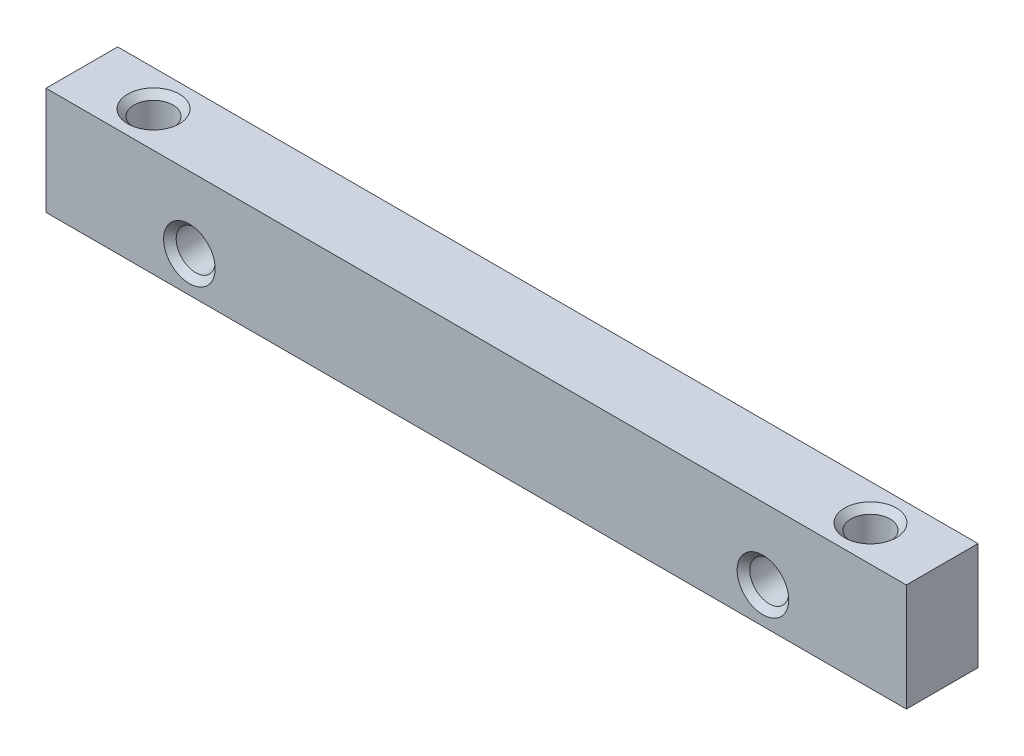
ISO-10303-21;
HEADER;
FILE_DESCRIPTION(('STEP AP214'),'2;1');
FILE_NAME('part.step','',(''),(''),'','','');
FILE_SCHEMA(('AUTOMOTIVE_DESIGN { 1 0 10303 214 1 1 1 1 }'));
ENDSEC;
DATA;
#1=APPLICATION_CONTEXT('core data for automotive mechanical design processes');
#2=APPLICATION_PROTOCOL_DEFINITION('international standard','automotive_design',2000,#1);
#3=PRODUCT_CONTEXT('',#1,'mechanical');
#4=PRODUCT('Part','Part','',(#3));
#5=PRODUCT_RELATED_PRODUCT_CATEGORY('part','',(#4));
#6=PRODUCT_DEFINITION_FORMATION('','',#4);
#7=PRODUCT_DEFINITION_CONTEXT('part definition',#1,'design');
#8=PRODUCT_DEFINITION('design','',#6,#7);
#9=PRODUCT_DEFINITION_SHAPE('','',#8);
#10=(LENGTH_UNIT() NAMED_UNIT(*) SI_UNIT(.MILLI.,.METRE.));
#11=(NAMED_UNIT(*) PLANE_ANGLE_UNIT() SI_UNIT($,.RADIAN.));
#12=(NAMED_UNIT(*) SI_UNIT($,.STERADIAN.) SOLID_ANGLE_UNIT());
#13=UNCERTAINTY_MEASURE_WITH_UNIT(LENGTH_MEASURE(1.E-05),#10,'distance_accuracy_value','');
#14=(GEOMETRIC_REPRESENTATION_CONTEXT(3) GLOBAL_UNCERTAINTY_ASSIGNED_CONTEXT((#13)) GLOBAL_UNIT_ASSIGNED_CONTEXT((#10,
#11,#12)) REPRESENTATION_CONTEXT('',''));
#15=CARTESIAN_POINT('',(0.,0.,0.));
#16=DIRECTION('',(0.,0.,1.));
#17=DIRECTION('',(1.,0.,0.));
#18=AXIS2_PLACEMENT_3D('',#15,#16,#17);
#19=CARTESIAN_POINT('',(38.1,4.7625,3.175));
#20=DIRECTION('',(0.,0.,-1.));
#21=DIRECTION('',(-1.,0.,0.));
#22=AXIS2_PLACEMENT_3D('',#19,#20,#21);
#23=PLANE('',#22);
#24=CARTESIAN_POINT('',(-25.4,-1.5875,3.175));
#25=DIRECTION('',(0.,0.,1.));
#26=DIRECTION('',(1.,0.,0.));
#27=AXIS2_PLACEMENT_3D('',#24,#25,#26);
#28=CIRCLE('',#27,2.286);
#29=CARTESIAN_POINT('',(-23.114,-1.5875,3.175));
#30=VERTEX_POINT('',#29);
#31=EDGE_CURVE('E153',#30,#30,#28,.T.);
#32=ORIENTED_EDGE('',*,*,#31,.F.);
#33=EDGE_LOOP('',(#32));
#34=FACE_BOUND('',#33,.T.);
#35=DIRECTION('',(0.,-1.,0.));
#36=VECTOR('',#35,1.);
#37=CARTESIAN_POINT('',(-38.1,4.7625,3.175));
#38=LINE('',#37,#36);
#39=CARTESIAN_POINT('',(-38.1,4.7625,3.175));
#40=VERTEX_POINT('',#39);
#41=CARTESIAN_POINT('',(-38.1,-4.7625,3.175));
#42=VERTEX_POINT('',#41);
#43=EDGE_CURVE('E103',#40,#42,#38,.T.);
#44=ORIENTED_EDGE('',*,*,#43,.T.);
#45=DIRECTION('',(-1.,0.,0.));
#46=VECTOR('',#45,1.);
#47=CARTESIAN_POINT('',(38.1,-4.7625,3.175));
#48=LINE('',#47,#46);
#49=CARTESIAN_POINT('',(38.1,-4.7625,3.175));
#50=VERTEX_POINT('',#49);
#51=EDGE_CURVE('E11',#50,#42,#48,.T.);
#52=ORIENTED_EDGE('',*,*,#51,.F.);
#53=DIRECTION('',(0.,-1.,0.));
#54=VECTOR('',#53,1.);
#55=CARTESIAN_POINT('',(38.1,4.7625,3.175));
#56=LINE('',#55,#54);
#57=CARTESIAN_POINT('',(38.1,4.7625,3.175));
#58=VERTEX_POINT('',#57);
#59=EDGE_CURVE('E90',#58,#50,#56,.T.);
#60=ORIENTED_EDGE('',*,*,#59,.F.);
#61=DIRECTION('',(-1.,0.,0.));
#62=VECTOR('',#61,1.);
#63=CARTESIAN_POINT('',(38.1,4.7625,3.175));
#64=LINE('',#63,#62);
#65=EDGE_CURVE('E99',#58,#40,#64,.T.);
#66=ORIENTED_EDGE('',*,*,#65,.T.);
#67=EDGE_LOOP('',(#44,#52,#60,#66));
#68=FACE_BOUND('',#67,.T.);
#69=CARTESIAN_POINT('',(25.4,-1.5875,3.175));
#70=DIRECTION('',(0.,0.,1.));
#71=DIRECTION('',(1.,0.,0.));
#72=AXIS2_PLACEMENT_3D('',#69,#70,#71);
#73=CIRCLE('',#72,2.286);
#74=CARTESIAN_POINT('',(27.686,-1.5875,3.175));
#75=VERTEX_POINT('',#74);
#76=EDGE_CURVE('E166',#75,#75,#73,.T.);
#77=ORIENTED_EDGE('',*,*,#76,.F.);
#78=EDGE_LOOP('',(#77));
#79=FACE_BOUND('',#78,.T.);
#80=ADVANCED_FACE('F35',(#34,#68,#79),#23,.F.);
#81=CARTESIAN_POINT('',(38.1,-4.7625,3.175));
#82=DIRECTION('',(0.,1.,0.));
#83=DIRECTION('',(0.,0.,1.));
#84=AXIS2_PLACEMENT_3D('',#81,#82,#83);
#85=PLANE('',#84);
#86=CARTESIAN_POINT('',(31.75,-4.7625,0.));
#87=DIRECTION('',(0.,1.,0.));
#88=DIRECTION('',(0.,0.,1.));
#89=AXIS2_PLACEMENT_3D('',#86,#87,#88);
#90=CIRCLE('',#89,2.286);
#91=CARTESIAN_POINT('',(31.75,-4.7625,2.28599999999999));
#92=VERTEX_POINT('',#91);
#93=EDGE_CURVE('E144',#92,#92,#90,.T.);
#94=ORIENTED_EDGE('',*,*,#93,.T.);
#95=EDGE_LOOP('',(#94));
#96=FACE_BOUND('',#95,.T.);
#97=CARTESIAN_POINT('',(-31.75,-4.7625,0.));
#98=DIRECTION('',(0.,1.,0.));
#99=DIRECTION('',(0.,0.,1.));
#100=AXIS2_PLACEMENT_3D('',#97,#98,#99);
#101=CIRCLE('',#100,2.286);
#102=CARTESIAN_POINT('',(-31.75,-4.7625,2.28599999999999));
#103=VERTEX_POINT('',#102);
#104=EDGE_CURVE('E131',#103,#103,#101,.T.);
#105=ORIENTED_EDGE('',*,*,#104,.T.);
#106=EDGE_LOOP('',(#105));
#107=FACE_BOUND('',#106,.T.);
#108=DIRECTION('',(0.,0.,-1.));
#109=VECTOR('',#108,1.);
#110=CARTESIAN_POINT('',(-38.1,-4.7625,3.175));
#111=LINE('',#110,#109);
#112=CARTESIAN_POINT('',(-38.1,-4.7625,-3.175));
#113=VERTEX_POINT('',#112);
#114=EDGE_CURVE('E94',#42,#113,#111,.T.);
#115=ORIENTED_EDGE('',*,*,#114,.T.);
#116=DIRECTION('',(-1.,0.,0.));
#117=VECTOR('',#116,1.);
#118=CARTESIAN_POINT('',(38.1,-4.7625,-3.175));
#119=LINE('',#118,#117);
#120=CARTESIAN_POINT('',(38.1,-4.7625,-3.175));
#121=VERTEX_POINT('',#120);
#122=EDGE_CURVE('E43',#121,#113,#119,.T.);
#123=ORIENTED_EDGE('',*,*,#122,.F.);
#124=DIRECTION('',(0.,0.,-1.));
#125=VECTOR('',#124,1.);
#126=CARTESIAN_POINT('',(38.1,-4.7625,3.175));
#127=LINE('',#126,#125);
#128=EDGE_CURVE('E85',#50,#121,#127,.T.);
#129=ORIENTED_EDGE('',*,*,#128,.F.);
#130=ORIENTED_EDGE('',*,*,#51,.T.);
#131=EDGE_LOOP('',(#115,#123,#129,#130));
#132=FACE_BOUND('',#131,.T.);
#133=ADVANCED_FACE('F93',(#96,#107,#132),#85,.F.);
#134=CARTESIAN_POINT('',(38.1,4.7625,-3.175));
#135=DIRECTION('',(0.,0.,1.));
#136=DIRECTION('',(1.,0.,0.));
#137=AXIS2_PLACEMENT_3D('',#134,#135,#136);
#138=PLANE('',#137);
#139=CARTESIAN_POINT('',(25.4,-1.5875,-3.175));
#140=DIRECTION('',(0.,0.,1.));
#141=DIRECTION('',(1.,0.,0.));
#142=AXIS2_PLACEMENT_3D('',#139,#140,#141);
#143=CIRCLE('',#142,2.286);
#144=CARTESIAN_POINT('',(27.686,-1.5875,-3.175));
#145=VERTEX_POINT('',#144);
#146=EDGE_CURVE('E169',#145,#145,#143,.T.);
#147=ORIENTED_EDGE('',*,*,#146,.T.);
#148=EDGE_LOOP('',(#147));
#149=FACE_BOUND('',#148,.T.);
#150=CARTESIAN_POINT('',(-25.4,-1.5875,-3.175));
#151=DIRECTION('',(0.,0.,1.));
#152=DIRECTION('',(1.,0.,0.));
#153=AXIS2_PLACEMENT_3D('',#150,#151,#152);
#154=CIRCLE('',#153,2.286);
#155=CARTESIAN_POINT('',(-23.114,-1.5875,-3.175));
#156=VERTEX_POINT('',#155);
#157=EDGE_CURVE('E156',#156,#156,#154,.T.);
#158=ORIENTED_EDGE('',*,*,#157,.T.);
#159=EDGE_LOOP('',(#158));
#160=FACE_BOUND('',#159,.T.);
#161=DIRECTION('',(0.,1.,0.));
#162=VECTOR('',#161,1.);
#163=CARTESIAN_POINT('',(-38.1,4.7625,-3.175));
#164=LINE('',#163,#162);
#165=CARTESIAN_POINT('',(-38.1,4.7625,-3.175));
#166=VERTEX_POINT('',#165);
#167=EDGE_CURVE('E72',#113,#166,#164,.T.);
#168=ORIENTED_EDGE('',*,*,#167,.T.);
#169=DIRECTION('',(-1.,0.,0.));
#170=VECTOR('',#169,1.);
#171=CARTESIAN_POINT('',(38.1,4.7625,-3.175));
#172=LINE('',#171,#170);
#173=CARTESIAN_POINT('',(38.1,4.7625,-3.175));
#174=VERTEX_POINT('',#173);
#175=EDGE_CURVE('E95',#174,#166,#172,.T.);
#176=ORIENTED_EDGE('',*,*,#175,.F.);
#177=DIRECTION('',(0.,1.,0.));
#178=VECTOR('',#177,1.);
#179=CARTESIAN_POINT('',(38.1,4.7625,-3.175));
#180=LINE('',#179,#178);
#181=EDGE_CURVE('E88',#121,#174,#180,.T.);
#182=ORIENTED_EDGE('',*,*,#181,.F.);
#183=ORIENTED_EDGE('',*,*,#122,.T.);
#184=EDGE_LOOP('',(#168,#176,#182,#183));
#185=FACE_BOUND('',#184,.T.);
#186=ADVANCED_FACE('F96',(#149,#160,#185),#138,.F.);
#187=CARTESIAN_POINT('',(38.1,4.7625,3.175));
#188=DIRECTION('',(0.,-1.,0.));
#189=DIRECTION('',(0.,0.,-1.));
#190=AXIS2_PLACEMENT_3D('',#187,#188,#189);
#191=PLANE('',#190);
#192=CARTESIAN_POINT('',(31.75,4.7625,0.));
#193=DIRECTION('',(0.,1.,0.));
#194=DIRECTION('',(0.,0.,1.));
#195=AXIS2_PLACEMENT_3D('',#192,#193,#194);
#196=CIRCLE('',#195,2.286);
#197=CARTESIAN_POINT('',(31.75,4.7625,2.286));
#198=VERTEX_POINT('',#197);
#199=EDGE_CURVE('E140',#198,#198,#196,.T.);
#200=ORIENTED_EDGE('',*,*,#199,.F.);
#201=EDGE_LOOP('',(#200));
#202=FACE_BOUND('',#201,.T.);
#203=CARTESIAN_POINT('',(-31.75,4.7625,0.));
#204=DIRECTION('',(0.,1.,0.));
#205=DIRECTION('',(0.,0.,1.));
#206=AXIS2_PLACEMENT_3D('',#203,#204,#205);
#207=CIRCLE('',#206,2.286);
#208=CARTESIAN_POINT('',(-31.75,4.7625,2.286));
#209=VERTEX_POINT('',#208);
#210=EDGE_CURVE('E127',#209,#209,#207,.T.);
#211=ORIENTED_EDGE('',*,*,#210,.F.);
#212=EDGE_LOOP('',(#211));
#213=FACE_BOUND('',#212,.T.);
#214=DIRECTION('',(0.,0.,1.));
#215=VECTOR('',#214,1.);
#216=CARTESIAN_POINT('',(-38.1,4.7625,3.175));
#217=LINE('',#216,#215);
#218=EDGE_CURVE('E78',#166,#40,#217,.T.);
#219=ORIENTED_EDGE('',*,*,#218,.T.);
#220=ORIENTED_EDGE('',*,*,#65,.F.);
#221=DIRECTION('',(0.,0.,1.));
#222=VECTOR('',#221,1.);
#223=CARTESIAN_POINT('',(38.1,4.7625,3.175));
#224=LINE('',#223,#222);
#225=EDGE_CURVE('E51',#174,#58,#224,.T.);
#226=ORIENTED_EDGE('',*,*,#225,.F.);
#227=ORIENTED_EDGE('',*,*,#175,.T.);
#228=EDGE_LOOP('',(#219,#220,#226,#227));
#229=FACE_BOUND('',#228,.T.);
#230=ADVANCED_FACE('F115',(#202,#213,#229),#191,.F.);
#231=CARTESIAN_POINT('',(38.1,-4.7625,3.175));
#232=DIRECTION('',(1.,0.,0.));
#233=DIRECTION('',(0.,0.,-1.));
#234=AXIS2_PLACEMENT_3D('',#231,#232,#233);
#235=PLANE('',#234);
#236=ORIENTED_EDGE('',*,*,#59,.T.);
#237=ORIENTED_EDGE('',*,*,#128,.T.);
#238=ORIENTED_EDGE('',*,*,#181,.T.);
#239=ORIENTED_EDGE('',*,*,#225,.T.);
#240=EDGE_LOOP('',(#236,#237,#238,#239));
#241=FACE_BOUND('',#240,.T.);
#242=ADVANCED_FACE('F86',(#241),#235,.T.);
#243=CARTESIAN_POINT('',(-38.1,-4.7625,3.175));
#244=DIRECTION('',(1.,0.,0.));
#245=DIRECTION('',(0.,0.,-1.));
#246=AXIS2_PLACEMENT_3D('',#243,#244,#245);
#247=PLANE('',#246);
#248=ORIENTED_EDGE('',*,*,#43,.F.);
#249=ORIENTED_EDGE('',*,*,#218,.F.);
#250=ORIENTED_EDGE('',*,*,#167,.F.);
#251=ORIENTED_EDGE('',*,*,#114,.F.);
#252=EDGE_LOOP('',(#248,#249,#250,#251));
#253=FACE_BOUND('',#252,.T.);
#254=ADVANCED_FACE('F118',(#253),#247,.F.);
#255=CARTESIAN_POINT('',(-31.75,-4.2037,0.));
#256=DIRECTION('',(0.,-1.,0.));
#257=DIRECTION('',(0.,0.,-1.));
#258=AXIS2_PLACEMENT_3D('',#255,#256,#257);
#259=CONICAL_SURFACE('',#258,1.7272,0.785398163397445);
#260=ORIENTED_EDGE('',*,*,#104,.F.);
#261=EDGE_LOOP('',(#260));
#262=FACE_BOUND('',#261,.T.);
#263=CARTESIAN_POINT('',(-31.75,-4.2037,0.));
#264=DIRECTION('',(0.,1.,0.));
#265=DIRECTION('',(0.,0.,1.));
#266=AXIS2_PLACEMENT_3D('',#263,#264,#265);
#267=CIRCLE('',#266,1.7272);
#268=CARTESIAN_POINT('',(-31.75,-4.2037,1.72719999999999));
#269=VERTEX_POINT('',#268);
#270=EDGE_CURVE('E106',#269,#269,#267,.T.);
#271=ORIENTED_EDGE('',*,*,#270,.T.);
#272=EDGE_LOOP('',(#271));
#273=FACE_BOUND('',#272,.T.);
#274=ADVANCED_FACE('F239',(#262,#273),#259,.F.);
#275=CARTESIAN_POINT('',(-31.75,4.7625,0.));
#276=DIRECTION('',(0.,1.,0.));
#277=DIRECTION('',(0.,0.,1.));
#278=AXIS2_PLACEMENT_3D('',#275,#276,#277);
#279=CYLINDRICAL_SURFACE('',#278,1.7272);
#280=ORIENTED_EDGE('',*,*,#270,.F.);
#281=EDGE_LOOP('',(#280));
#282=FACE_BOUND('',#281,.T.);
#283=CARTESIAN_POINT('',(-31.75,4.2037,0.));
#284=DIRECTION('',(0.,1.,0.));
#285=DIRECTION('',(0.,0.,1.));
#286=AXIS2_PLACEMENT_3D('',#283,#284,#285);
#287=CIRCLE('',#286,1.7272);
#288=CARTESIAN_POINT('',(-31.75,4.2037,1.7272));
#289=VERTEX_POINT('',#288);
#290=EDGE_CURVE('E124',#289,#289,#287,.T.);
#291=ORIENTED_EDGE('',*,*,#290,.T.);
#292=EDGE_LOOP('',(#291));
#293=FACE_BOUND('',#292,.T.);
#294=ADVANCED_FACE('F235',(#282,#293),#279,.F.);
#295=CARTESIAN_POINT('',(-31.75,4.7625,0.));
#296=DIRECTION('',(0.,1.,0.));
#297=DIRECTION('',(0.,0.,1.));
#298=AXIS2_PLACEMENT_3D('',#295,#296,#297);
#299=CONICAL_SURFACE('',#298,2.286,0.785398163397447);
#300=ORIENTED_EDGE('',*,*,#290,.F.);
#301=EDGE_LOOP('',(#300));
#302=FACE_BOUND('',#301,.T.);
#303=ORIENTED_EDGE('',*,*,#210,.T.);
#304=EDGE_LOOP('',(#303));
#305=FACE_BOUND('',#304,.T.);
#306=ADVANCED_FACE('F231',(#302,#305),#299,.F.);
#307=CARTESIAN_POINT('',(31.75,-4.2037,0.));
#308=DIRECTION('',(0.,-1.,0.));
#309=DIRECTION('',(0.,0.,-1.));
#310=AXIS2_PLACEMENT_3D('',#307,#308,#309);
#311=CONICAL_SURFACE('',#310,1.7272,0.785398163397445);
#312=ORIENTED_EDGE('',*,*,#93,.F.);
#313=EDGE_LOOP('',(#312));
#314=FACE_BOUND('',#313,.T.);
#315=CARTESIAN_POINT('',(31.75,-4.2037,0.));
#316=DIRECTION('',(0.,1.,0.));
#317=DIRECTION('',(0.,0.,1.));
#318=AXIS2_PLACEMENT_3D('',#315,#316,#317);
#319=CIRCLE('',#318,1.7272);
#320=CARTESIAN_POINT('',(31.75,-4.2037,1.72719999999999));
#321=VERTEX_POINT('',#320);
#322=EDGE_CURVE('E134',#321,#321,#319,.T.);
#323=ORIENTED_EDGE('',*,*,#322,.T.);
#324=EDGE_LOOP('',(#323));
#325=FACE_BOUND('',#324,.T.);
#326=ADVANCED_FACE('F227',(#314,#325),#311,.F.);
#327=CARTESIAN_POINT('',(31.75,4.7625,0.));
#328=DIRECTION('',(0.,1.,0.));
#329=DIRECTION('',(0.,0.,1.));
#330=AXIS2_PLACEMENT_3D('',#327,#328,#329);
#331=CYLINDRICAL_SURFACE('',#330,1.7272);
#332=ORIENTED_EDGE('',*,*,#322,.F.);
#333=EDGE_LOOP('',(#332));
#334=FACE_BOUND('',#333,.T.);
#335=CARTESIAN_POINT('',(31.75,4.2037,0.));
#336=DIRECTION('',(0.,1.,0.));
#337=DIRECTION('',(0.,0.,1.));
#338=AXIS2_PLACEMENT_3D('',#335,#336,#337);
#339=CIRCLE('',#338,1.7272);
#340=CARTESIAN_POINT('',(31.75,4.2037,1.7272));
#341=VERTEX_POINT('',#340);
#342=EDGE_CURVE('E137',#341,#341,#339,.T.);
#343=ORIENTED_EDGE('',*,*,#342,.T.);
#344=EDGE_LOOP('',(#343));
#345=FACE_BOUND('',#344,.T.);
#346=ADVANCED_FACE('F223',(#334,#345),#331,.F.);
#347=CARTESIAN_POINT('',(31.75,4.7625,0.));
#348=DIRECTION('',(0.,1.,0.));
#349=DIRECTION('',(0.,0.,1.));
#350=AXIS2_PLACEMENT_3D('',#347,#348,#349);
#351=CONICAL_SURFACE('',#350,2.286,0.785398163397444);
#352=ORIENTED_EDGE('',*,*,#342,.F.);
#353=EDGE_LOOP('',(#352));
#354=FACE_BOUND('',#353,.T.);
#355=ORIENTED_EDGE('',*,*,#199,.T.);
#356=EDGE_LOOP('',(#355));
#357=FACE_BOUND('',#356,.T.);
#358=ADVANCED_FACE('F219',(#354,#357),#351,.F.);
#359=CARTESIAN_POINT('',(-25.4,-1.5875,-2.6162));
#360=DIRECTION('',(0.,0.,-1.));
#361=DIRECTION('',(-1.,0.,0.));
#362=AXIS2_PLACEMENT_3D('',#359,#360,#361);
#363=CONICAL_SURFACE('',#362,1.7272,0.785398163397448);
#364=ORIENTED_EDGE('',*,*,#157,.F.);
#365=EDGE_LOOP('',(#364));
#366=FACE_BOUND('',#365,.T.);
#367=CARTESIAN_POINT('',(-25.4,-1.5875,-2.6162));
#368=DIRECTION('',(0.,0.,1.));
#369=DIRECTION('',(1.,0.,0.));
#370=AXIS2_PLACEMENT_3D('',#367,#368,#369);
#371=CIRCLE('',#370,1.7272);
#372=CARTESIAN_POINT('',(-23.6728,-1.5875,-2.6162));
#373=VERTEX_POINT('',#372);
#374=EDGE_CURVE('E147',#373,#373,#371,.T.);
#375=ORIENTED_EDGE('',*,*,#374,.T.);
#376=EDGE_LOOP('',(#375));
#377=FACE_BOUND('',#376,.T.);
#378=ADVANCED_FACE('F212',(#366,#377),#363,.F.);
#379=CARTESIAN_POINT('',(-25.4,-1.5875,3.175));
#380=DIRECTION('',(0.,0.,1.));
#381=DIRECTION('',(1.,0.,0.));
#382=AXIS2_PLACEMENT_3D('',#379,#380,#381);
#383=CYLINDRICAL_SURFACE('',#382,1.72719999999999);
#384=ORIENTED_EDGE('',*,*,#374,.F.);
#385=EDGE_LOOP('',(#384));
#386=FACE_BOUND('',#385,.T.);
#387=CARTESIAN_POINT('',(-25.4,-1.5875,2.6162));
#388=DIRECTION('',(0.,0.,1.));
#389=DIRECTION('',(1.,0.,0.));
#390=AXIS2_PLACEMENT_3D('',#387,#388,#389);
#391=CIRCLE('',#390,1.72719999999999);
#392=CARTESIAN_POINT('',(-23.6728,-1.5875,2.6162));
#393=VERTEX_POINT('',#392);
#394=EDGE_CURVE('E150',#393,#393,#391,.T.);
#395=ORIENTED_EDGE('',*,*,#394,.T.);
#396=EDGE_LOOP('',(#395));
#397=FACE_BOUND('',#396,.T.);
#398=ADVANCED_FACE('F206',(#386,#397),#383,.F.);
#399=CARTESIAN_POINT('',(-25.4,-1.5875,3.175));
#400=DIRECTION('',(0.,0.,1.));
#401=DIRECTION('',(1.,0.,0.));
#402=AXIS2_PLACEMENT_3D('',#399,#400,#401);
#403=CONICAL_SURFACE('',#402,2.286,0.785398163397459);
#404=ORIENTED_EDGE('',*,*,#394,.F.);
#405=EDGE_LOOP('',(#404));
#406=FACE_BOUND('',#405,.T.);
#407=ORIENTED_EDGE('',*,*,#31,.T.);
#408=EDGE_LOOP('',(#407));
#409=FACE_BOUND('',#408,.T.);
#410=ADVANCED_FACE('F183',(#406,#409),#403,.F.);
#411=CARTESIAN_POINT('',(25.4,-1.5875,-2.6162));
#412=DIRECTION('',(0.,0.,-1.));
#413=DIRECTION('',(-1.,0.,0.));
#414=AXIS2_PLACEMENT_3D('',#411,#412,#413);
#415=CONICAL_SURFACE('',#414,1.7272,0.785398163397448);
#416=ORIENTED_EDGE('',*,*,#146,.F.);
#417=EDGE_LOOP('',(#416));
#418=FACE_BOUND('',#417,.T.);
#419=CARTESIAN_POINT('',(25.4,-1.5875,-2.6162));
#420=DIRECTION('',(0.,0.,1.));
#421=DIRECTION('',(1.,0.,0.));
#422=AXIS2_PLACEMENT_3D('',#419,#420,#421);
#423=CIRCLE('',#422,1.7272);
#424=CARTESIAN_POINT('',(27.1272,-1.5875,-2.6162));
#425=VERTEX_POINT('',#424);
#426=EDGE_CURVE('E160',#425,#425,#423,.T.);
#427=ORIENTED_EDGE('',*,*,#426,.T.);
#428=EDGE_LOOP('',(#427));
#429=FACE_BOUND('',#428,.T.);
#430=ADVANCED_FACE('F179',(#418,#429),#415,.F.);
#431=CARTESIAN_POINT('',(25.4,-1.5875,3.175));
#432=DIRECTION('',(0.,0.,1.));
#433=DIRECTION('',(1.,0.,0.));
#434=AXIS2_PLACEMENT_3D('',#431,#432,#433);
#435=CYLINDRICAL_SURFACE('',#434,1.72719999999999);
#436=ORIENTED_EDGE('',*,*,#426,.F.);
#437=EDGE_LOOP('',(#436));
#438=FACE_BOUND('',#437,.T.);
#439=CARTESIAN_POINT('',(25.4,-1.5875,2.6162));
#440=DIRECTION('',(0.,0.,1.));
#441=DIRECTION('',(1.,0.,0.));
#442=AXIS2_PLACEMENT_3D('',#439,#440,#441);
#443=CIRCLE('',#442,1.72719999999999);
#444=CARTESIAN_POINT('',(27.1272,-1.5875,2.6162));
#445=VERTEX_POINT('',#444);
#446=EDGE_CURVE('E163',#445,#445,#443,.T.);
#447=ORIENTED_EDGE('',*,*,#446,.T.);
#448=EDGE_LOOP('',(#447));
#449=FACE_BOUND('',#448,.T.);
#450=ADVANCED_FACE('F182',(#438,#449),#435,.F.);
#451=CARTESIAN_POINT('',(25.4,-1.5875,3.175));
#452=DIRECTION('',(0.,0.,1.));
#453=DIRECTION('',(1.,0.,0.));
#454=AXIS2_PLACEMENT_3D('',#451,#452,#453);
#455=CONICAL_SURFACE('',#454,2.286,0.785398163397459);
#456=ORIENTED_EDGE('',*,*,#446,.F.);
#457=EDGE_LOOP('',(#456));
#458=FACE_BOUND('',#457,.T.);
#459=ORIENTED_EDGE('',*,*,#76,.T.);
#460=EDGE_LOOP('',(#459));
#461=FACE_BOUND('',#460,.T.);
#462=ADVANCED_FACE('F189',(#458,#461),#455,.F.);
#463=CLOSED_SHELL('',(#80,#133,#186,#230,#242,#254,#274,#294,#306,#326,#346,#358,#378,#398,#410,
#430,#450,#462));
#464=MANIFOLD_SOLID_BREP('B2',#463);
#465=ADVANCED_BREP_SHAPE_REPRESENTATION('',(#18,#464),#14);
#466=SHAPE_DEFINITION_REPRESENTATION(#9,#465);
ENDSEC;
END-ISO-10303-21;
